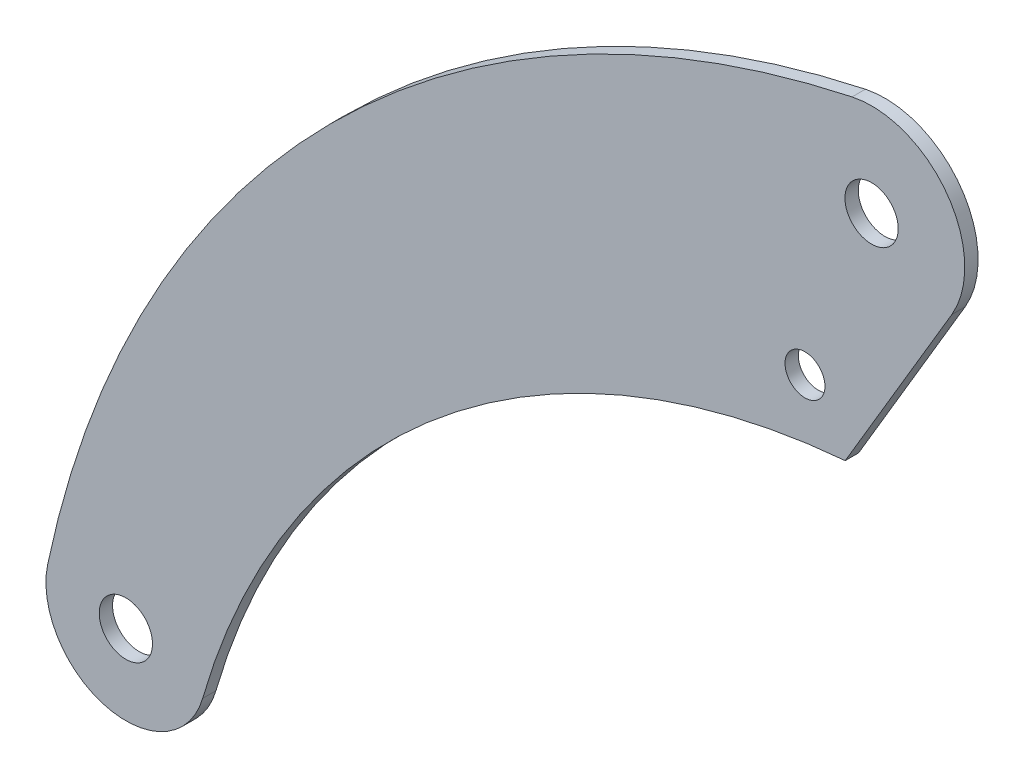
ISO-10303-21;
HEADER;
FILE_DESCRIPTION(('STEP AP214'),'2;1');
FILE_NAME('part.step','',(''),(''),'','','');
FILE_SCHEMA(('AUTOMOTIVE_DESIGN { 1 0 10303 214 1 1 1 1 }'));
ENDSEC;
DATA;
#1=APPLICATION_CONTEXT('core data for automotive mechanical design processes');
#2=APPLICATION_PROTOCOL_DEFINITION('international standard','automotive_design',2000,#1);
#3=PRODUCT_CONTEXT('',#1,'mechanical');
#4=PRODUCT('Part','Part','',(#3));
#5=PRODUCT_RELATED_PRODUCT_CATEGORY('part','',(#4));
#6=PRODUCT_DEFINITION_FORMATION('','',#4);
#7=PRODUCT_DEFINITION_CONTEXT('part definition',#1,'design');
#8=PRODUCT_DEFINITION('design','',#6,#7);
#9=PRODUCT_DEFINITION_SHAPE('','',#8);
#10=(LENGTH_UNIT() NAMED_UNIT(*) SI_UNIT(.MILLI.,.METRE.));
#11=(NAMED_UNIT(*) PLANE_ANGLE_UNIT() SI_UNIT($,.RADIAN.));
#12=(NAMED_UNIT(*) SI_UNIT($,.STERADIAN.) SOLID_ANGLE_UNIT());
#13=UNCERTAINTY_MEASURE_WITH_UNIT(LENGTH_MEASURE(1.E-05),#10,'distance_accuracy_value','');
#14=(GEOMETRIC_REPRESENTATION_CONTEXT(3) GLOBAL_UNCERTAINTY_ASSIGNED_CONTEXT((#13)) GLOBAL_UNIT_ASSIGNED_CONTEXT((#10,
#11,#12)) REPRESENTATION_CONTEXT('',''));
#15=CARTESIAN_POINT('',(0.,0.,0.));
#16=DIRECTION('',(0.,0.,1.));
#17=DIRECTION('',(1.,0.,0.));
#18=AXIS2_PLACEMENT_3D('',#15,#16,#17);
#19=CARTESIAN_POINT('',(149.481823007681,-699.199674335093,5.));
#20=DIRECTION('',(0.,0.,-1.));
#21=DIRECTION('',(-1.,0.,0.));
#22=AXIS2_PLACEMENT_3D('',#19,#20,#21);
#23=PLANE('',#22);
#24=CARTESIAN_POINT('',(149.481823007681,-699.199674335093,5.));
#25=DIRECTION('',(0.,0.,1.));
#26=DIRECTION('',(-1.,0.,0.));
#27=AXIS2_PLACEMENT_3D('',#24,#25,#26);
#28=CIRCLE('',#27,785.);
#29=CARTESIAN_POINT('',(-14.6345840706821,68.4531149698692,5.));
#30=VERTEX_POINT('',#29);
#31=CARTESIAN_POINT('',(-618.715737076498,-537.652440744682,5.));
#32=VERTEX_POINT('',#31);
#33=EDGE_CURVE('E133',#30,#32,#28,.T.);
#34=ORIENTED_EDGE('',*,*,#33,.T.);
#35=CARTESIAN_POINT('',(-560.,-550.,5.));
#36=DIRECTION('',(0.,0.,1.));
#37=DIRECTION('',(1.,0.,0.));
#38=AXIS2_PLACEMENT_3D('',#35,#36,#37);
#39=CIRCLE('',#38,60.0000000000001);
#40=CARTESIAN_POINT('',(-502.341900982989,-566.599506551236,5.));
#41=VERTEX_POINT('',#40);
#42=EDGE_CURVE('E91',#32,#41,#39,.T.);
#43=ORIENTED_EDGE('',*,*,#42,.T.);
#44=CARTESIAN_POINT('',(26.1906733396147,-718.761649937565,5.));
#45=DIRECTION('',(0.,0.,-1.));
#46=DIRECTION('',(-1.,0.,0.));
#47=AXIS2_PLACEMENT_3D('',#44,#45,#46);
#48=CIRCLE('',#47,550.);
#49=CARTESIAN_POINT('',(-19.7795926456078,-170.686167321121,5.));
#50=VERTEX_POINT('',#49);
#51=EDGE_CURVE('E95',#41,#50,#48,.T.);
#52=ORIENTED_EDGE('',*,*,#51,.T.);
#53=DIRECTION('',(0.509802390301733,0.860291533634174,0.));
#54=VECTOR('',#53,1.);
#55=CARTESIAN_POINT('',(60.2204073543922,-35.6861673211213,5.));
#56=LINE('',#55,#54);
#57=CARTESIAN_POINT('',(60.2204073543922,-35.6861673211213,5.));
#58=VERTEX_POINT('',#57);
#59=EDGE_CURVE('E99',#50,#58,#56,.T.);
#60=ORIENTED_EDGE('',*,*,#59,.T.);
#61=CARTESIAN_POINT('',(0.,0.,5.));
#62=DIRECTION('',(0.,0.,1.));
#63=DIRECTION('',(1.,0.,0.));
#64=AXIS2_PLACEMENT_3D('',#61,#62,#63);
#65=CIRCLE('',#64,69.9999999999999);
#66=EDGE_CURVE('E57',#58,#30,#65,.T.);
#67=ORIENTED_EDGE('',*,*,#66,.T.);
#68=EDGE_LOOP('',(#34,#43,#52,#60,#67));
#69=FACE_BOUND('',#68,.T.);
#70=CARTESIAN_POINT('',(0.,0.,5.));
#71=DIRECTION('',(0.,0.,1.));
#72=DIRECTION('',(1.,0.,0.));
#73=AXIS2_PLACEMENT_3D('',#70,#71,#72);
#74=CIRCLE('',#73,20.);
#75=CARTESIAN_POINT('',(20.,0.,5.));
#76=VERTEX_POINT('',#75);
#77=EDGE_CURVE('E124',#76,#76,#74,.T.);
#78=ORIENTED_EDGE('',*,*,#77,.F.);
#79=EDGE_LOOP('',(#78));
#80=FACE_BOUND('',#79,.T.);
#81=CARTESIAN_POINT('',(-50.,-130.,5.));
#82=DIRECTION('',(0.,0.,1.));
#83=DIRECTION('',(1.,0.,0.));
#84=AXIS2_PLACEMENT_3D('',#81,#82,#83);
#85=CIRCLE('',#84,15.);
#86=CARTESIAN_POINT('',(-35.,-130.,5.));
#87=VERTEX_POINT('',#86);
#88=EDGE_CURVE('E187',#87,#87,#85,.T.);
#89=ORIENTED_EDGE('',*,*,#88,.F.);
#90=EDGE_LOOP('',(#89));
#91=FACE_BOUND('',#90,.T.);
#92=CARTESIAN_POINT('',(-560.,-550.,5.));
#93=DIRECTION('',(0.,0.,1.));
#94=DIRECTION('',(1.,0.,0.));
#95=AXIS2_PLACEMENT_3D('',#92,#93,#94);
#96=CIRCLE('',#95,20.0000000000001);
#97=CARTESIAN_POINT('',(-540.,-550.,5.));
#98=VERTEX_POINT('',#97);
#99=EDGE_CURVE('E176',#98,#98,#96,.T.);
#100=ORIENTED_EDGE('',*,*,#99,.F.);
#101=EDGE_LOOP('',(#100));
#102=FACE_BOUND('',#101,.T.);
#103=ADVANCED_FACE('F39',(#69,#80,#91,#102),#23,.F.);
#104=CARTESIAN_POINT('',(149.481823007681,-699.199674335093,-5.));
#105=DIRECTION('',(0.,0.,-1.));
#106=DIRECTION('',(-1.,0.,0.));
#107=AXIS2_PLACEMENT_3D('',#104,#105,#106);
#108=PLANE('',#107);
#109=CARTESIAN_POINT('',(-50.,-130.,-5.));
#110=DIRECTION('',(0.,0.,1.));
#111=DIRECTION('',(1.,0.,0.));
#112=AXIS2_PLACEMENT_3D('',#109,#110,#111);
#113=CIRCLE('',#112,15.);
#114=CARTESIAN_POINT('',(-35.,-130.,-5.));
#115=VERTEX_POINT('',#114);
#116=EDGE_CURVE('E184',#115,#115,#113,.T.);
#117=ORIENTED_EDGE('',*,*,#116,.T.);
#118=EDGE_LOOP('',(#117));
#119=FACE_BOUND('',#118,.T.);
#120=CARTESIAN_POINT('',(149.481823007681,-699.199674335093,-5.));
#121=DIRECTION('',(0.,0.,1.));
#122=DIRECTION('',(-1.,0.,0.));
#123=AXIS2_PLACEMENT_3D('',#120,#121,#122);
#124=CIRCLE('',#123,785.);
#125=CARTESIAN_POINT('',(-14.6345840706821,68.4531149698692,-5.));
#126=VERTEX_POINT('',#125);
#127=CARTESIAN_POINT('',(-618.715737076498,-537.652440744682,-5.));
#128=VERTEX_POINT('',#127);
#129=EDGE_CURVE('E119',#126,#128,#124,.T.);
#130=ORIENTED_EDGE('',*,*,#129,.F.);
#131=CARTESIAN_POINT('',(0.,0.,-5.));
#132=DIRECTION('',(0.,0.,1.));
#133=DIRECTION('',(1.,0.,0.));
#134=AXIS2_PLACEMENT_3D('',#131,#132,#133);
#135=CIRCLE('',#134,69.9999999999999);
#136=CARTESIAN_POINT('',(60.2204073543922,-35.6861673211213,-5.));
#137=VERTEX_POINT('',#136);
#138=EDGE_CURVE('E83',#137,#126,#135,.T.);
#139=ORIENTED_EDGE('',*,*,#138,.F.);
#140=DIRECTION('',(0.509802390301733,0.860291533634174,0.));
#141=VECTOR('',#140,1.);
#142=CARTESIAN_POINT('',(60.2204073543922,-35.6861673211213,-5.));
#143=LINE('',#142,#141);
#144=CARTESIAN_POINT('',(-19.7795926456078,-170.686167321121,-5.));
#145=VERTEX_POINT('',#144);
#146=EDGE_CURVE('E77',#145,#137,#143,.T.);
#147=ORIENTED_EDGE('',*,*,#146,.F.);
#148=CARTESIAN_POINT('',(26.1906733396147,-718.761649937565,-5.));
#149=DIRECTION('',(0.,0.,-1.));
#150=DIRECTION('',(-1.,0.,0.));
#151=AXIS2_PLACEMENT_3D('',#148,#149,#150);
#152=CIRCLE('',#151,550.);
#153=CARTESIAN_POINT('',(-502.341900982989,-566.599506551236,-5.));
#154=VERTEX_POINT('',#153);
#155=EDGE_CURVE('E107',#154,#145,#152,.T.);
#156=ORIENTED_EDGE('',*,*,#155,.F.);
#157=CARTESIAN_POINT('',(-560.,-550.,-5.));
#158=DIRECTION('',(0.,0.,1.));
#159=DIRECTION('',(1.,0.,0.));
#160=AXIS2_PLACEMENT_3D('',#157,#158,#159);
#161=CIRCLE('',#160,60.0000000000001);
#162=EDGE_CURVE('E123',#128,#154,#161,.T.);
#163=ORIENTED_EDGE('',*,*,#162,.F.);
#164=EDGE_LOOP('',(#130,#139,#147,#156,#163));
#165=FACE_BOUND('',#164,.T.);
#166=CARTESIAN_POINT('',(0.,0.,-5.));
#167=DIRECTION('',(0.,0.,1.));
#168=DIRECTION('',(1.,0.,0.));
#169=AXIS2_PLACEMENT_3D('',#166,#167,#168);
#170=CIRCLE('',#169,20.);
#171=CARTESIAN_POINT('',(20.,0.,-5.));
#172=VERTEX_POINT('',#171);
#173=EDGE_CURVE('E191',#172,#172,#170,.T.);
#174=ORIENTED_EDGE('',*,*,#173,.T.);
#175=EDGE_LOOP('',(#174));
#176=FACE_BOUND('',#175,.T.);
#177=CARTESIAN_POINT('',(-560.,-550.,-5.));
#178=DIRECTION('',(0.,0.,1.));
#179=DIRECTION('',(1.,0.,0.));
#180=AXIS2_PLACEMENT_3D('',#177,#178,#179);
#181=CIRCLE('',#180,20.0000000000001);
#182=CARTESIAN_POINT('',(-540.,-550.,-5.));
#183=VERTEX_POINT('',#182);
#184=EDGE_CURVE('E179',#183,#183,#181,.T.);
#185=ORIENTED_EDGE('',*,*,#184,.T.);
#186=EDGE_LOOP('',(#185));
#187=FACE_BOUND('',#186,.T.);
#188=ADVANCED_FACE('F140',(#119,#165,#176,#187),#108,.T.);
#189=CARTESIAN_POINT('',(149.481823007681,-699.199674335093,5.));
#190=DIRECTION('',(0.,0.,-1.));
#191=DIRECTION('',(-1.,0.,0.));
#192=AXIS2_PLACEMENT_3D('',#189,#190,#191);
#193=CYLINDRICAL_SURFACE('',#192,785.);
#194=ORIENTED_EDGE('',*,*,#129,.T.);
#195=DIRECTION('',(0.,0.,-1.));
#196=VECTOR('',#195,1.);
#197=CARTESIAN_POINT('',(-618.715737076498,-537.652440744682,5.));
#198=LINE('',#197,#196);
#199=EDGE_CURVE('E11',#32,#128,#198,.T.);
#200=ORIENTED_EDGE('',*,*,#199,.F.);
#201=ORIENTED_EDGE('',*,*,#33,.F.);
#202=DIRECTION('',(0.,0.,-1.));
#203=VECTOR('',#202,1.);
#204=CARTESIAN_POINT('',(-14.6345840706821,68.4531149698692,5.));
#205=LINE('',#204,#203);
#206=EDGE_CURVE('E115',#30,#126,#205,.T.);
#207=ORIENTED_EDGE('',*,*,#206,.T.);
#208=EDGE_LOOP('',(#194,#200,#201,#207));
#209=FACE_BOUND('',#208,.T.);
#210=ADVANCED_FACE('F41',(#209),#193,.T.);
#211=CARTESIAN_POINT('',(-560.,-550.,5.));
#212=DIRECTION('',(0.,0.,-1.));
#213=DIRECTION('',(-1.,0.,0.));
#214=AXIS2_PLACEMENT_3D('',#211,#212,#213);
#215=CYLINDRICAL_SURFACE('',#214,60.0000000000001);
#216=ORIENTED_EDGE('',*,*,#162,.T.);
#217=DIRECTION('',(0.,0.,-1.));
#218=VECTOR('',#217,1.);
#219=CARTESIAN_POINT('',(-502.341900982989,-566.599506551236,5.));
#220=LINE('',#219,#218);
#221=EDGE_CURVE('E49',#41,#154,#220,.T.);
#222=ORIENTED_EDGE('',*,*,#221,.F.);
#223=ORIENTED_EDGE('',*,*,#42,.F.);
#224=ORIENTED_EDGE('',*,*,#199,.T.);
#225=EDGE_LOOP('',(#216,#222,#223,#224));
#226=FACE_BOUND('',#225,.T.);
#227=ADVANCED_FACE('F238',(#226),#215,.T.);
#228=CARTESIAN_POINT('',(26.1906733396147,-718.761649937565,5.));
#229=DIRECTION('',(0.,0.,-1.));
#230=DIRECTION('',(-1.,0.,0.));
#231=AXIS2_PLACEMENT_3D('',#228,#229,#230);
#232=CYLINDRICAL_SURFACE('',#231,550.);
#233=ORIENTED_EDGE('',*,*,#155,.T.);
#234=DIRECTION('',(0.,0.,-1.));
#235=VECTOR('',#234,1.);
#236=CARTESIAN_POINT('',(-19.7795926456078,-170.686167321121,5.));
#237=LINE('',#236,#235);
#238=EDGE_CURVE('E104',#50,#145,#237,.T.);
#239=ORIENTED_EDGE('',*,*,#238,.F.);
#240=ORIENTED_EDGE('',*,*,#51,.F.);
#241=ORIENTED_EDGE('',*,*,#221,.T.);
#242=EDGE_LOOP('',(#233,#239,#240,#241));
#243=FACE_BOUND('',#242,.T.);
#244=ADVANCED_FACE('F105',(#243),#232,.F.);
#245=CARTESIAN_POINT('',(60.2204073543922,-35.6861673211213,5.));
#246=DIRECTION('',(-0.860291533634174,0.509802390301733,0.));
#247=DIRECTION('',(-0.509802390301733,-0.860291533634174,0.));
#248=AXIS2_PLACEMENT_3D('',#245,#246,#247);
#249=PLANE('',#248);
#250=ORIENTED_EDGE('',*,*,#146,.T.);
#251=DIRECTION('',(0.,0.,-1.));
#252=VECTOR('',#251,1.);
#253=CARTESIAN_POINT('',(60.2204073543922,-35.6861673211213,5.));
#254=LINE('',#253,#252);
#255=EDGE_CURVE('E109',#58,#137,#254,.T.);
#256=ORIENTED_EDGE('',*,*,#255,.F.);
#257=ORIENTED_EDGE('',*,*,#59,.F.);
#258=ORIENTED_EDGE('',*,*,#238,.T.);
#259=EDGE_LOOP('',(#250,#256,#257,#258));
#260=FACE_BOUND('',#259,.T.);
#261=ADVANCED_FACE('F111',(#260),#249,.F.);
#262=CARTESIAN_POINT('',(0.,0.,5.));
#263=DIRECTION('',(0.,0.,-1.));
#264=DIRECTION('',(-1.,0.,0.));
#265=AXIS2_PLACEMENT_3D('',#262,#263,#264);
#266=CYLINDRICAL_SURFACE('',#265,69.9999999999999);
#267=ORIENTED_EDGE('',*,*,#138,.T.);
#268=ORIENTED_EDGE('',*,*,#206,.F.);
#269=ORIENTED_EDGE('',*,*,#66,.F.);
#270=ORIENTED_EDGE('',*,*,#255,.T.);
#271=EDGE_LOOP('',(#267,#268,#269,#270));
#272=FACE_BOUND('',#271,.T.);
#273=ADVANCED_FACE('F145',(#272),#266,.T.);
#274=CARTESIAN_POINT('',(0.,0.,5.));
#275=DIRECTION('',(0.,0.,-1.));
#276=DIRECTION('',(-1.,0.,0.));
#277=AXIS2_PLACEMENT_3D('',#274,#275,#276);
#278=CYLINDRICAL_SURFACE('',#277,20.);
#279=ORIENTED_EDGE('',*,*,#77,.T.);
#280=EDGE_LOOP('',(#279));
#281=FACE_BOUND('',#280,.T.);
#282=ORIENTED_EDGE('',*,*,#173,.F.);
#283=EDGE_LOOP('',(#282));
#284=FACE_BOUND('',#283,.T.);
#285=ADVANCED_FACE('F147',(#281,#284),#278,.F.);
#286=CARTESIAN_POINT('',(-50.,-130.,5.));
#287=DIRECTION('',(0.,0.,-1.));
#288=DIRECTION('',(-1.,0.,0.));
#289=AXIS2_PLACEMENT_3D('',#286,#287,#288);
#290=CYLINDRICAL_SURFACE('',#289,15.);
#291=ORIENTED_EDGE('',*,*,#88,.T.);
#292=EDGE_LOOP('',(#291));
#293=FACE_BOUND('',#292,.T.);
#294=ORIENTED_EDGE('',*,*,#116,.F.);
#295=EDGE_LOOP('',(#294));
#296=FACE_BOUND('',#295,.T.);
#297=ADVANCED_FACE('F153',(#293,#296),#290,.F.);
#298=CARTESIAN_POINT('',(-560.,-550.,5.));
#299=DIRECTION('',(0.,0.,-1.));
#300=DIRECTION('',(-1.,0.,0.));
#301=AXIS2_PLACEMENT_3D('',#298,#299,#300);
#302=CYLINDRICAL_SURFACE('',#301,20.0000000000001);
#303=ORIENTED_EDGE('',*,*,#99,.T.);
#304=EDGE_LOOP('',(#303));
#305=FACE_BOUND('',#304,.T.);
#306=ORIENTED_EDGE('',*,*,#184,.F.);
#307=EDGE_LOOP('',(#306));
#308=FACE_BOUND('',#307,.T.);
#309=ADVANCED_FACE('F167',(#305,#308),#302,.F.);
#310=CLOSED_SHELL('',(#103,#188,#210,#227,#244,#261,#273,#285,#297,#309));
#311=MANIFOLD_SOLID_BREP('B2',#310);
#312=ADVANCED_BREP_SHAPE_REPRESENTATION('',(#18,#311),#14);
#313=SHAPE_DEFINITION_REPRESENTATION(#9,#312);
ENDSEC;
END-ISO-10303-21;
